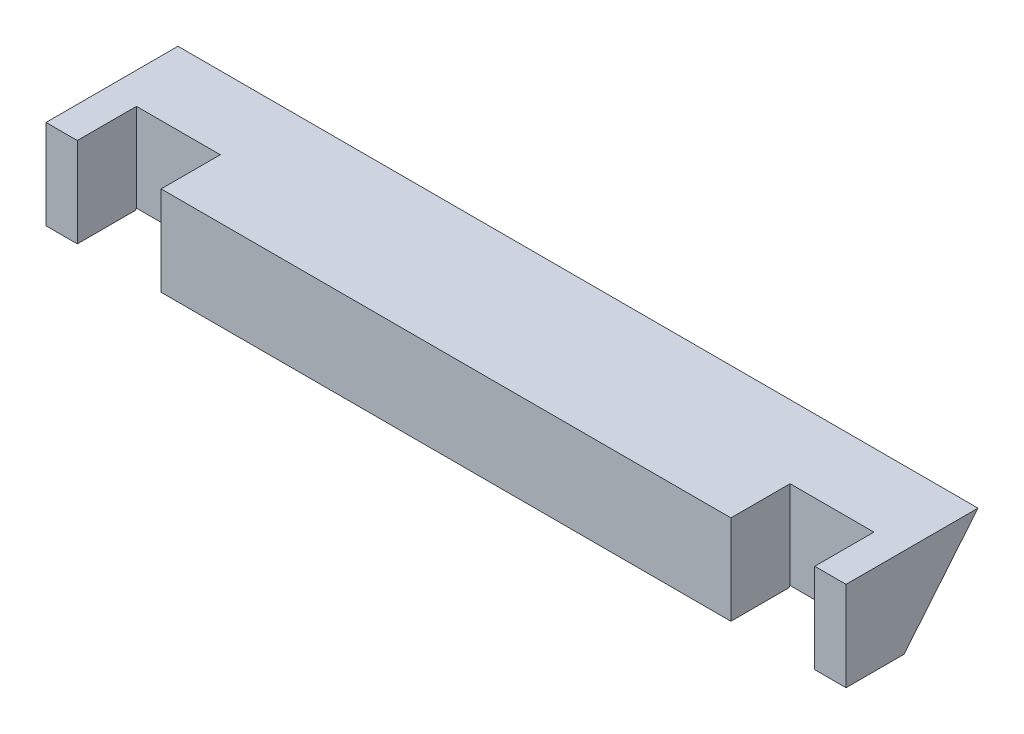
ISO-10303-21;
HEADER;
FILE_DESCRIPTION(('STEP AP214'),'2;1');
FILE_NAME('part.step','',(''),(''),'','','');
FILE_SCHEMA(('AUTOMOTIVE_DESIGN { 1 0 10303 214 1 1 1 1 }'));
ENDSEC;
DATA;
#1=APPLICATION_CONTEXT('core data for automotive mechanical design processes');
#2=APPLICATION_PROTOCOL_DEFINITION('international standard','automotive_design',2000,#1);
#3=PRODUCT_CONTEXT('',#1,'mechanical');
#4=PRODUCT('Part','Part','',(#3));
#5=PRODUCT_RELATED_PRODUCT_CATEGORY('part','',(#4));
#6=PRODUCT_DEFINITION_FORMATION('','',#4);
#7=PRODUCT_DEFINITION_CONTEXT('part definition',#1,'design');
#8=PRODUCT_DEFINITION('design','',#6,#7);
#9=PRODUCT_DEFINITION_SHAPE('','',#8);
#10=(LENGTH_UNIT() NAMED_UNIT(*) SI_UNIT(.MILLI.,.METRE.));
#11=(NAMED_UNIT(*) PLANE_ANGLE_UNIT() SI_UNIT($,.RADIAN.));
#12=(NAMED_UNIT(*) SI_UNIT($,.STERADIAN.) SOLID_ANGLE_UNIT());
#13=UNCERTAINTY_MEASURE_WITH_UNIT(LENGTH_MEASURE(1.E-05),#10,'distance_accuracy_value','');
#14=(GEOMETRIC_REPRESENTATION_CONTEXT(3) GLOBAL_UNCERTAINTY_ASSIGNED_CONTEXT((#13)) GLOBAL_UNIT_ASSIGNED_CONTEXT((#10,
#11,#12)) REPRESENTATION_CONTEXT('',''));
#15=CARTESIAN_POINT('',(0.,0.,0.));
#16=DIRECTION('',(0.,0.,1.));
#17=DIRECTION('',(1.,0.,0.));
#18=AXIS2_PLACEMENT_3D('',#15,#16,#17);
#19=CARTESIAN_POINT('',(0.,-45.987734948605,62.9188192914831));
#20=DIRECTION('',(0.,1.,0.));
#21=DIRECTION('',(0.,0.,1.));
#22=AXIS2_PLACEMENT_3D('',#19,#20,#21);
#23=PLANE('',#22);
#24=DIRECTION('',(1.,0.,0.));
#25=VECTOR('',#24,1.);
#26=CARTESIAN_POINT('',(0.,-45.987734948605,62.9188192914831));
#27=LINE('',#26,#25);
#28=CARTESIAN_POINT('',(667.81,-45.987734948605,62.9188192914831));
#29=VERTEX_POINT('',#28);
#30=CARTESIAN_POINT('',(695.,-45.987734948605,62.9188192914831));
#31=VERTEX_POINT('',#30);
#32=EDGE_CURVE('E206',#29,#31,#27,.T.);
#33=ORIENTED_EDGE('',*,*,#32,.F.);
#34=DIRECTION('',(0.,0.,-1.));
#35=VECTOR('',#34,1.);
#36=CARTESIAN_POINT('',(667.81,-45.987734948605,62.9188192914831));
#37=LINE('',#36,#35);
#38=CARTESIAN_POINT('',(667.81,-45.987734948605,12.5088192914831));
#39=VERTEX_POINT('',#38);
#40=EDGE_CURVE('E174',#29,#39,#37,.T.);
#41=ORIENTED_EDGE('',*,*,#40,.T.);
#42=DIRECTION('',(-1.,0.,0.));
#43=VECTOR('',#42,1.);
#44=CARTESIAN_POINT('',(695.,-45.987734948605,12.5088192914831));
#45=LINE('',#44,#43);
#46=CARTESIAN_POINT('',(695.,-45.987734948605,12.5088192914831));
#47=VERTEX_POINT('',#46);
#48=EDGE_CURVE('E236',#47,#39,#45,.T.);
#49=ORIENTED_EDGE('',*,*,#48,.F.);
#50=DIRECTION('',(0.,0.,-1.));
#51=VECTOR('',#50,1.);
#52=CARTESIAN_POINT('',(695.,-45.987734948605,62.9188192914831));
#53=LINE('',#52,#51);
#54=EDGE_CURVE('E218',#31,#47,#53,.T.);
#55=ORIENTED_EDGE('',*,*,#54,.F.);
#56=EDGE_LOOP('',(#33,#41,#49,#55));
#57=FACE_BOUND('',#56,.T.);
#58=ADVANCED_FACE('F35',(#57),#23,.F.);
#59=CARTESIAN_POINT('',(0.,0.,62.9188192914831));
#60=DIRECTION('',(0.,0.,1.));
#61=DIRECTION('',(1.,0.,0.));
#62=AXIS2_PLACEMENT_3D('',#59,#60,#61);
#63=PLANE('',#62);
#64=DIRECTION('',(0.,1.,0.));
#65=VECTOR('',#64,1.);
#66=CARTESIAN_POINT('',(667.81,-968.177734948605,62.9188192914831));
#67=LINE('',#66,#65);
#68=CARTESIAN_POINT('',(667.81,31.822265051395,62.9188192914831));
#69=VERTEX_POINT('',#68);
#70=EDGE_CURVE('E162',#29,#69,#67,.T.);
#71=ORIENTED_EDGE('',*,*,#70,.F.);
#72=ORIENTED_EDGE('',*,*,#32,.T.);
#73=DIRECTION('',(0.,1.,0.));
#74=VECTOR('',#73,1.);
#75=CARTESIAN_POINT('',(695.,31.822265051395,62.9188192914831));
#76=LINE('',#75,#74);
#77=CARTESIAN_POINT('',(695.,31.822265051395,62.9188192914831));
#78=VERTEX_POINT('',#77);
#79=EDGE_CURVE('E210',#31,#78,#76,.T.);
#80=ORIENTED_EDGE('',*,*,#79,.T.);
#81=DIRECTION('',(-1.,0.,0.));
#82=VECTOR('',#81,1.);
#83=CARTESIAN_POINT('',(0.,31.822265051395,62.9188192914831));
#84=LINE('',#83,#82);
#85=EDGE_CURVE('E215',#78,#69,#84,.T.);
#86=ORIENTED_EDGE('',*,*,#85,.T.);
#87=EDGE_LOOP('',(#71,#72,#80,#86));
#88=FACE_BOUND('',#87,.T.);
#89=ADVANCED_FACE('F271',(#88),#63,.T.);
#90=CARTESIAN_POINT('',(594.99,-45.987734948605,12.5088192914831));
#91=VERTEX_POINT('',#90);
#92=CARTESIAN_POINT('',(100.01,-45.987734948605,12.5088192914831));
#93=VERTEX_POINT('',#92);
#94=EDGE_CURVE('E240',#91,#93,#45,.T.);
#95=ORIENTED_EDGE('',*,*,#94,.F.);
#96=DIRECTION('',(0.,0.,1.));
#97=VECTOR('',#96,1.);
#98=CARTESIAN_POINT('',(594.99,-45.987734948605,62.9188192914831));
#99=LINE('',#98,#97);
#100=CARTESIAN_POINT('',(594.99,-45.987734948605,62.9188192914831));
#101=VERTEX_POINT('',#100);
#102=EDGE_CURVE('E168',#91,#101,#99,.T.);
#103=ORIENTED_EDGE('',*,*,#102,.T.);
#104=CARTESIAN_POINT('',(100.01,-45.987734948605,62.9188192914831));
#105=VERTEX_POINT('',#104);
#106=EDGE_CURVE('E211',#105,#101,#27,.T.);
#107=ORIENTED_EDGE('',*,*,#106,.F.);
#108=DIRECTION('',(0.,0.,-1.));
#109=VECTOR('',#108,1.);
#110=CARTESIAN_POINT('',(100.01,-45.987734948605,62.9188192914831));
#111=LINE('',#110,#109);
#112=EDGE_CURVE('E194',#105,#93,#111,.T.);
#113=ORIENTED_EDGE('',*,*,#112,.T.);
#114=EDGE_LOOP('',(#95,#103,#107,#113));
#115=FACE_BOUND('',#114,.T.);
#116=ADVANCED_FACE('F264',(#115),#23,.F.);
#117=DIRECTION('',(0.,1.,0.));
#118=VECTOR('',#117,1.);
#119=CARTESIAN_POINT('',(594.99,-968.177734948605,62.9188192914831));
#120=LINE('',#119,#118);
#121=CARTESIAN_POINT('',(594.99,31.822265051395,62.9188192914831));
#122=VERTEX_POINT('',#121);
#123=EDGE_CURVE('E146',#101,#122,#120,.T.);
#124=ORIENTED_EDGE('',*,*,#123,.T.);
#125=CARTESIAN_POINT('',(100.01,31.822265051395,62.9188192914831));
#126=VERTEX_POINT('',#125);
#127=EDGE_CURVE('E157',#122,#126,#84,.T.);
#128=ORIENTED_EDGE('',*,*,#127,.T.);
#129=DIRECTION('',(0.,1.,0.));
#130=VECTOR('',#129,1.);
#131=CARTESIAN_POINT('',(100.01,0.,62.9188192914831));
#132=LINE('',#131,#130);
#133=EDGE_CURVE('E11',#105,#126,#132,.T.);
#134=ORIENTED_EDGE('',*,*,#133,.F.);
#135=ORIENTED_EDGE('',*,*,#106,.T.);
#136=EDGE_LOOP('',(#124,#128,#134,#135));
#137=FACE_BOUND('',#136,.T.);
#138=ADVANCED_FACE('F279',(#137),#63,.T.);
#139=CARTESIAN_POINT('',(695.,-45.987734948605,12.5088192914831));
#140=DIRECTION('',(0.,0.636540705826315,0.771243106825686));
#141=DIRECTION('',(0.,-0.771243106825686,0.636540705826315));
#142=AXIS2_PLACEMENT_3D('',#139,#140,#141);
#143=PLANE('',#142);
#144=ORIENTED_EDGE('',*,*,#48,.T.);
#145=DIRECTION('',(0.,0.771243106825686,-0.636540705826315));
#146=VECTOR('',#145,1.);
#147=CARTESIAN_POINT('',(667.81,-45.987734948605,12.5088192914831));
#148=LINE('',#147,#146);
#149=CARTESIAN_POINT('',(667.81,-44.7882347928903,11.5188192914831));
#150=VERTEX_POINT('',#149);
#151=EDGE_CURVE('E171',#39,#150,#148,.T.);
#152=ORIENTED_EDGE('',*,*,#151,.T.);
#153=DIRECTION('',(-1.,0.,0.));
#154=VECTOR('',#153,1.);
#155=CARTESIAN_POINT('',(695.,-44.7882347928903,11.5188192914831));
#156=LINE('',#155,#154);
#157=CARTESIAN_POINT('',(594.99,-44.7882347928903,11.5188192914831));
#158=VERTEX_POINT('',#157);
#159=EDGE_CURVE('E164',#150,#158,#156,.T.);
#160=ORIENTED_EDGE('',*,*,#159,.T.);
#161=DIRECTION('',(0.,-0.771243106825686,0.636540705826315));
#162=VECTOR('',#161,1.);
#163=CARTESIAN_POINT('',(594.99,-45.987734948605,12.5088192914831));
#164=LINE('',#163,#162);
#165=EDGE_CURVE('E143',#158,#91,#164,.T.);
#166=ORIENTED_EDGE('',*,*,#165,.T.);
#167=ORIENTED_EDGE('',*,*,#94,.T.);
#168=DIRECTION('',(0.,0.771243106825686,-0.636540705826315));
#169=VECTOR('',#168,1.);
#170=CARTESIAN_POINT('',(100.01,-45.987734948605,12.5088192914831));
#171=LINE('',#170,#169);
#172=CARTESIAN_POINT('',(100.01,-44.7882347928903,11.5188192914831));
#173=VERTEX_POINT('',#172);
#174=EDGE_CURVE('E197',#93,#173,#171,.T.);
#175=ORIENTED_EDGE('',*,*,#174,.T.);
#176=DIRECTION('',(-1.,0.,0.));
#177=VECTOR('',#176,1.);
#178=CARTESIAN_POINT('',(695.,-44.7882347928902,11.5188192914831));
#179=LINE('',#178,#177);
#180=CARTESIAN_POINT('',(27.19,-44.7882347928903,11.5188192914831));
#181=VERTEX_POINT('',#180);
#182=EDGE_CURVE('E200',#173,#181,#179,.T.);
#183=ORIENTED_EDGE('',*,*,#182,.T.);
#184=DIRECTION('',(0.,-0.771243106825686,0.636540705826315));
#185=VECTOR('',#184,1.);
#186=CARTESIAN_POINT('',(27.19,-45.987734948605,12.5088192914831));
#187=LINE('',#186,#185);
#188=CARTESIAN_POINT('',(27.19,-45.987734948605,12.5088192914831));
#189=VERTEX_POINT('',#188);
#190=EDGE_CURVE('E191',#181,#189,#187,.T.);
#191=ORIENTED_EDGE('',*,*,#190,.T.);
#192=CARTESIAN_POINT('',(0.,-45.987734948605,12.5088192914831));
#193=VERTEX_POINT('',#192);
#194=EDGE_CURVE('E231',#189,#193,#45,.T.);
#195=ORIENTED_EDGE('',*,*,#194,.T.);
#196=DIRECTION('',(0.,0.771243106825686,-0.636540705826315));
#197=VECTOR('',#196,1.);
#198=CARTESIAN_POINT('',(0.,-45.987734948605,12.5088192914831));
#199=LINE('',#198,#197);
#200=CARTESIAN_POINT('',(0.,31.822265051395,-51.7111807085169));
#201=VERTEX_POINT('',#200);
#202=EDGE_CURVE('E224',#193,#201,#199,.T.);
#203=ORIENTED_EDGE('',*,*,#202,.T.);
#204=DIRECTION('',(-1.,0.,0.));
#205=VECTOR('',#204,1.);
#206=CARTESIAN_POINT('',(695.,31.822265051395,-51.7111807085169));
#207=LINE('',#206,#205);
#208=CARTESIAN_POINT('',(695.,31.822265051395,-51.7111807085169));
#209=VERTEX_POINT('',#208);
#210=EDGE_CURVE('E239',#209,#201,#207,.T.);
#211=ORIENTED_EDGE('',*,*,#210,.F.);
#212=DIRECTION('',(0.,0.771243106825686,-0.636540705826315));
#213=VECTOR('',#212,1.);
#214=CARTESIAN_POINT('',(695.,-45.987734948605,12.5088192914831));
#215=LINE('',#214,#213);
#216=EDGE_CURVE('E225',#47,#209,#215,.T.);
#217=ORIENTED_EDGE('',*,*,#216,.F.);
#218=EDGE_LOOP('',(#144,#152,#160,#166,#167,#175,#183,#191,#195,#203,#211,#217));
#219=FACE_BOUND('',#218,.T.);
#220=ADVANCED_FACE('F37',(#219),#143,.F.);
#221=CARTESIAN_POINT('',(695.,31.822265051395,-51.7111807085169));
#222=DIRECTION('',(0.,-1.,0.));
#223=DIRECTION('',(0.,0.,-1.));
#224=AXIS2_PLACEMENT_3D('',#221,#222,#223);
#225=PLANE('',#224);
#226=DIRECTION('',(-1.,0.,0.));
#227=VECTOR('',#226,1.);
#228=CARTESIAN_POINT('',(667.81,31.822265051395,11.5188192914831));
#229=LINE('',#228,#227);
#230=CARTESIAN_POINT('',(667.81,31.822265051395,11.5188192914831));
#231=VERTEX_POINT('',#230);
#232=CARTESIAN_POINT('',(594.99,31.822265051395,11.5188192914831));
#233=VERTEX_POINT('',#232);
#234=EDGE_CURVE('E150',#231,#233,#229,.T.);
#235=ORIENTED_EDGE('',*,*,#234,.F.);
#236=DIRECTION('',(0.,0.,-1.));
#237=VECTOR('',#236,1.);
#238=CARTESIAN_POINT('',(667.81,31.822265051395,62.9188192914831));
#239=LINE('',#238,#237);
#240=EDGE_CURVE('E50',#69,#231,#239,.T.);
#241=ORIENTED_EDGE('',*,*,#240,.F.);
#242=ORIENTED_EDGE('',*,*,#85,.F.);
#243=DIRECTION('',(0.,0.,1.));
#244=VECTOR('',#243,1.);
#245=CARTESIAN_POINT('',(695.,31.822265051395,-51.7111807085169));
#246=LINE('',#245,#244);
#247=EDGE_CURVE('E228',#209,#78,#246,.T.);
#248=ORIENTED_EDGE('',*,*,#247,.F.);
#249=ORIENTED_EDGE('',*,*,#210,.T.);
#250=DIRECTION('',(0.,0.,1.));
#251=VECTOR('',#250,1.);
#252=CARTESIAN_POINT('',(0.,31.822265051395,-51.7111807085169));
#253=LINE('',#252,#251);
#254=CARTESIAN_POINT('',(0.,31.822265051395,62.9188192914831));
#255=VERTEX_POINT('',#254);
#256=EDGE_CURVE('E229',#201,#255,#253,.T.);
#257=ORIENTED_EDGE('',*,*,#256,.T.);
#258=CARTESIAN_POINT('',(27.19,31.822265051395,62.9188192914831));
#259=VERTEX_POINT('',#258);
#260=EDGE_CURVE('E214',#259,#255,#84,.T.);
#261=ORIENTED_EDGE('',*,*,#260,.F.);
#262=DIRECTION('',(0.,0.,1.));
#263=VECTOR('',#262,1.);
#264=CARTESIAN_POINT('',(27.19,31.822265051395,62.9188192914831));
#265=LINE('',#264,#263);
#266=CARTESIAN_POINT('',(27.19,31.822265051395,11.5188192914831));
#267=VERTEX_POINT('',#266);
#268=EDGE_CURVE('E58',#267,#259,#265,.T.);
#269=ORIENTED_EDGE('',*,*,#268,.F.);
#270=DIRECTION('',(-1.,0.,0.));
#271=VECTOR('',#270,1.);
#272=CARTESIAN_POINT('',(100.01,31.822265051395,11.5188192914831));
#273=LINE('',#272,#271);
#274=CARTESIAN_POINT('',(100.01,31.822265051395,11.5188192914831));
#275=VERTEX_POINT('',#274);
#276=EDGE_CURVE('E180',#275,#267,#273,.T.);
#277=ORIENTED_EDGE('',*,*,#276,.F.);
#278=DIRECTION('',(0.,0.,-1.));
#279=VECTOR('',#278,1.);
#280=CARTESIAN_POINT('',(100.01,31.822265051395,62.9188192914831));
#281=LINE('',#280,#279);
#282=EDGE_CURVE('E177',#126,#275,#281,.T.);
#283=ORIENTED_EDGE('',*,*,#282,.F.);
#284=ORIENTED_EDGE('',*,*,#127,.F.);
#285=DIRECTION('',(0.,0.,1.));
#286=VECTOR('',#285,1.);
#287=CARTESIAN_POINT('',(594.99,31.822265051395,62.9188192914831));
#288=LINE('',#287,#286);
#289=EDGE_CURVE('E140',#233,#122,#288,.T.);
#290=ORIENTED_EDGE('',*,*,#289,.F.);
#291=EDGE_LOOP('',(#235,#241,#242,#248,#249,#257,#261,#269,#277,#283,#284,#290));
#292=FACE_BOUND('',#291,.T.);
#293=ADVANCED_FACE('F155',(#292),#225,.F.);
#294=CARTESIAN_POINT('',(695.,0.,0.));
#295=DIRECTION('',(1.,0.,0.));
#296=DIRECTION('',(0.,0.,-1.));
#297=AXIS2_PLACEMENT_3D('',#294,#295,#296);
#298=PLANE('',#297);
#299=ORIENTED_EDGE('',*,*,#216,.T.);
#300=ORIENTED_EDGE('',*,*,#247,.T.);
#301=ORIENTED_EDGE('',*,*,#79,.F.);
#302=ORIENTED_EDGE('',*,*,#54,.T.);
#303=EDGE_LOOP('',(#299,#300,#301,#302));
#304=FACE_BOUND('',#303,.T.);
#305=ADVANCED_FACE('F277',(#304),#298,.T.);
#306=CARTESIAN_POINT('',(0.,0.,0.));
#307=DIRECTION('',(1.,0.,0.));
#308=DIRECTION('',(0.,0.,-1.));
#309=AXIS2_PLACEMENT_3D('',#306,#307,#308);
#310=PLANE('',#309);
#311=ORIENTED_EDGE('',*,*,#202,.F.);
#312=DIRECTION('',(0.,0.,-1.));
#313=VECTOR('',#312,1.);
#314=CARTESIAN_POINT('',(0.,-45.987734948605,62.9188192914831));
#315=LINE('',#314,#313);
#316=CARTESIAN_POINT('',(0.,-45.987734948605,62.9188192914831));
#317=VERTEX_POINT('',#316);
#318=EDGE_CURVE('E221',#317,#193,#315,.T.);
#319=ORIENTED_EDGE('',*,*,#318,.F.);
#320=DIRECTION('',(0.,-1.,0.));
#321=VECTOR('',#320,1.);
#322=CARTESIAN_POINT('',(0.,31.822265051395,62.9188192914831));
#323=LINE('',#322,#321);
#324=EDGE_CURVE('E203',#255,#317,#323,.T.);
#325=ORIENTED_EDGE('',*,*,#324,.F.);
#326=ORIENTED_EDGE('',*,*,#256,.F.);
#327=EDGE_LOOP('',(#311,#319,#325,#326));
#328=FACE_BOUND('',#327,.T.);
#329=ADVANCED_FACE('F253',(#328),#310,.F.);
#330=ORIENTED_EDGE('',*,*,#194,.F.);
#331=DIRECTION('',(0.,0.,1.));
#332=VECTOR('',#331,1.);
#333=CARTESIAN_POINT('',(27.19,-45.987734948605,62.9188192914831));
#334=LINE('',#333,#332);
#335=CARTESIAN_POINT('',(27.19,-45.987734948605,62.9188192914831));
#336=VERTEX_POINT('',#335);
#337=EDGE_CURVE('E187',#189,#336,#334,.T.);
#338=ORIENTED_EDGE('',*,*,#337,.T.);
#339=EDGE_CURVE('E207',#317,#336,#27,.T.);
#340=ORIENTED_EDGE('',*,*,#339,.F.);
#341=ORIENTED_EDGE('',*,*,#318,.T.);
#342=EDGE_LOOP('',(#330,#338,#340,#341));
#343=FACE_BOUND('',#342,.T.);
#344=ADVANCED_FACE('F247',(#343),#23,.F.);
#345=DIRECTION('',(0.,-1.,0.));
#346=VECTOR('',#345,1.);
#347=CARTESIAN_POINT('',(27.19,0.,62.9188192914831));
#348=LINE('',#347,#346);
#349=EDGE_CURVE('E43',#259,#336,#348,.T.);
#350=ORIENTED_EDGE('',*,*,#349,.F.);
#351=ORIENTED_EDGE('',*,*,#260,.T.);
#352=ORIENTED_EDGE('',*,*,#324,.T.);
#353=ORIENTED_EDGE('',*,*,#339,.T.);
#354=EDGE_LOOP('',(#350,#351,#352,#353));
#355=FACE_BOUND('',#354,.T.);
#356=ADVANCED_FACE('F248',(#355),#63,.T.);
#357=CARTESIAN_POINT('',(100.01,-968.177734948605,11.5188192914831));
#358=DIRECTION('',(0.,0.,-1.));
#359=DIRECTION('',(-1.,0.,0.));
#360=AXIS2_PLACEMENT_3D('',#357,#358,#359);
#361=PLANE('',#360);
#362=DIRECTION('',(0.,1.,0.));
#363=VECTOR('',#362,1.);
#364=CARTESIAN_POINT('',(100.01,-968.177734948605,11.5188192914831));
#365=LINE('',#364,#363);
#366=EDGE_CURVE('E184',#173,#275,#365,.T.);
#367=ORIENTED_EDGE('',*,*,#366,.T.);
#368=ORIENTED_EDGE('',*,*,#276,.T.);
#369=DIRECTION('',(0.,1.,0.));
#370=VECTOR('',#369,1.);
#371=CARTESIAN_POINT('',(27.19,-968.177734948605,11.5188192914831));
#372=LINE('',#371,#370);
#373=EDGE_CURVE('E185',#181,#267,#372,.T.);
#374=ORIENTED_EDGE('',*,*,#373,.F.);
#375=ORIENTED_EDGE('',*,*,#182,.F.);
#376=EDGE_LOOP('',(#367,#368,#374,#375));
#377=FACE_BOUND('',#376,.T.);
#378=ADVANCED_FACE('F282',(#377),#361,.F.);
#379=CARTESIAN_POINT('',(100.01,-968.177734948605,62.9188192914831));
#380=DIRECTION('',(1.,0.,0.));
#381=DIRECTION('',(0.,0.,-1.));
#382=AXIS2_PLACEMENT_3D('',#379,#380,#381);
#383=PLANE('',#382);
#384=ORIENTED_EDGE('',*,*,#112,.F.);
#385=ORIENTED_EDGE('',*,*,#133,.T.);
#386=ORIENTED_EDGE('',*,*,#282,.T.);
#387=ORIENTED_EDGE('',*,*,#366,.F.);
#388=ORIENTED_EDGE('',*,*,#174,.F.);
#389=EDGE_LOOP('',(#384,#385,#386,#387,#388));
#390=FACE_BOUND('',#389,.T.);
#391=ADVANCED_FACE('F261',(#390),#383,.F.);
#392=CARTESIAN_POINT('',(27.19,-968.177734948605,62.9188192914831));
#393=DIRECTION('',(-1.,0.,0.));
#394=DIRECTION('',(0.,0.,1.));
#395=AXIS2_PLACEMENT_3D('',#392,#393,#394);
#396=PLANE('',#395);
#397=ORIENTED_EDGE('',*,*,#373,.T.);
#398=ORIENTED_EDGE('',*,*,#268,.T.);
#399=ORIENTED_EDGE('',*,*,#349,.T.);
#400=ORIENTED_EDGE('',*,*,#337,.F.);
#401=ORIENTED_EDGE('',*,*,#190,.F.);
#402=EDGE_LOOP('',(#397,#398,#399,#400,#401));
#403=FACE_BOUND('',#402,.T.);
#404=ADVANCED_FACE('F242',(#403),#396,.F.);
#405=CARTESIAN_POINT('',(667.81,-968.177734948605,62.9188192914831));
#406=DIRECTION('',(1.,0.,0.));
#407=DIRECTION('',(0.,0.,-1.));
#408=AXIS2_PLACEMENT_3D('',#405,#406,#407);
#409=PLANE('',#408);
#410=ORIENTED_EDGE('',*,*,#70,.T.);
#411=ORIENTED_EDGE('',*,*,#240,.T.);
#412=DIRECTION('',(0.,1.,0.));
#413=VECTOR('',#412,1.);
#414=CARTESIAN_POINT('',(667.81,-968.177734948605,11.5188192914831));
#415=LINE('',#414,#413);
#416=EDGE_CURVE('E147',#150,#231,#415,.T.);
#417=ORIENTED_EDGE('',*,*,#416,.F.);
#418=ORIENTED_EDGE('',*,*,#151,.F.);
#419=ORIENTED_EDGE('',*,*,#40,.F.);
#420=EDGE_LOOP('',(#410,#411,#417,#418,#419));
#421=FACE_BOUND('',#420,.T.);
#422=ADVANCED_FACE('F341',(#421),#409,.F.);
#423=CARTESIAN_POINT('',(594.99,-968.177734948605,62.9188192914831));
#424=DIRECTION('',(-1.,0.,0.));
#425=DIRECTION('',(0.,0.,1.));
#426=AXIS2_PLACEMENT_3D('',#423,#424,#425);
#427=PLANE('',#426);
#428=ORIENTED_EDGE('',*,*,#165,.F.);
#429=DIRECTION('',(0.,1.,0.));
#430=VECTOR('',#429,1.);
#431=CARTESIAN_POINT('',(594.99,-968.177734948605,11.5188192914831));
#432=LINE('',#431,#430);
#433=EDGE_CURVE('E136',#158,#233,#432,.T.);
#434=ORIENTED_EDGE('',*,*,#433,.T.);
#435=ORIENTED_EDGE('',*,*,#289,.T.);
#436=ORIENTED_EDGE('',*,*,#123,.F.);
#437=ORIENTED_EDGE('',*,*,#102,.F.);
#438=EDGE_LOOP('',(#428,#434,#435,#436,#437));
#439=FACE_BOUND('',#438,.T.);
#440=ADVANCED_FACE('F138',(#439),#427,.F.);
#441=CARTESIAN_POINT('',(667.81,-968.177734948605,11.5188192914831));
#442=DIRECTION('',(0.,0.,-1.));
#443=DIRECTION('',(-1.,0.,0.));
#444=AXIS2_PLACEMENT_3D('',#441,#442,#443);
#445=PLANE('',#444);
#446=ORIENTED_EDGE('',*,*,#416,.T.);
#447=ORIENTED_EDGE('',*,*,#234,.T.);
#448=ORIENTED_EDGE('',*,*,#433,.F.);
#449=ORIENTED_EDGE('',*,*,#159,.F.);
#450=EDGE_LOOP('',(#446,#447,#448,#449));
#451=FACE_BOUND('',#450,.T.);
#452=ADVANCED_FACE('F151',(#451),#445,.F.);
#453=CLOSED_SHELL('',(#58,#89,#116,#138,#220,#293,#305,#329,#344,#356,#378,#391,#404,#422,#440,#452));
#454=MANIFOLD_SOLID_BREP('B2',#453);
#455=ADVANCED_BREP_SHAPE_REPRESENTATION('',(#18,#454),#14);
#456=SHAPE_DEFINITION_REPRESENTATION(#9,#455);
ENDSEC;
END-ISO-10303-21;
